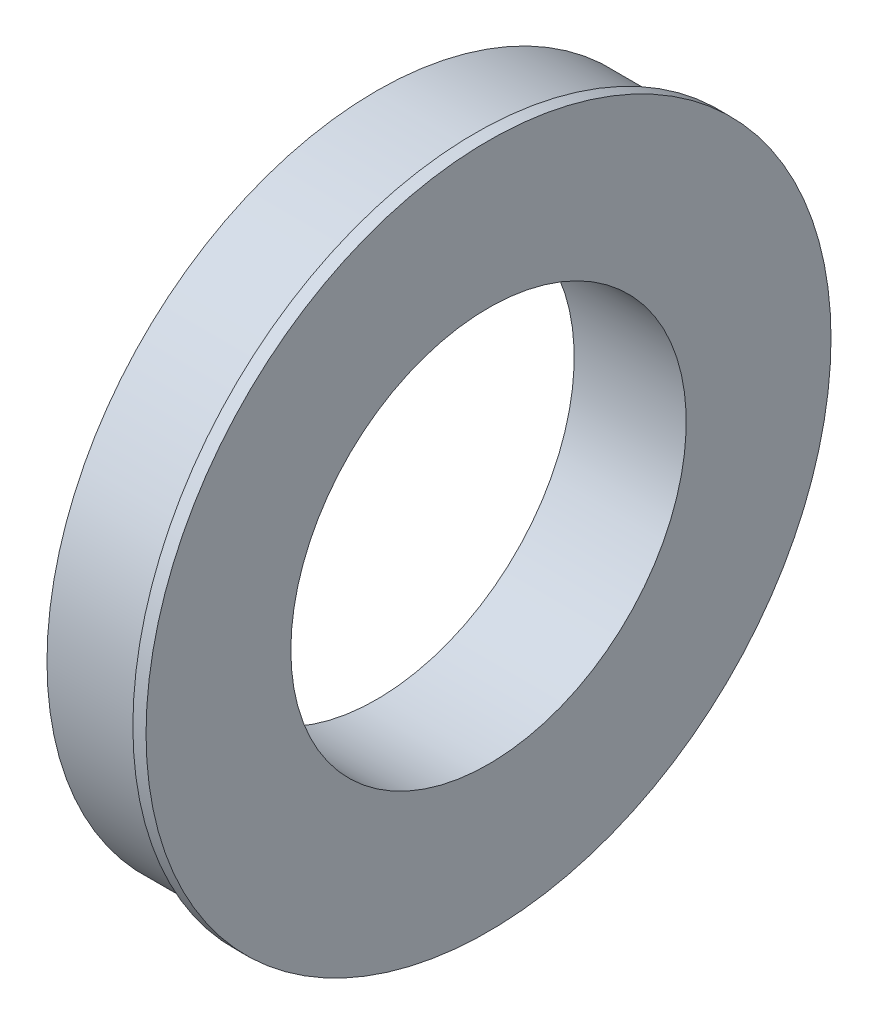
ISO-10303-21;
HEADER;
FILE_DESCRIPTION(('STEP AP214'),'2;1');
FILE_NAME('part.step','',(''),(''),'','','');
FILE_SCHEMA(('AUTOMOTIVE_DESIGN { 1 0 10303 214 1 1 1 1 }'));
ENDSEC;
DATA;
#1=APPLICATION_CONTEXT('core data for automotive mechanical design processes');
#2=APPLICATION_PROTOCOL_DEFINITION('international standard','automotive_design',2000,#1);
#3=PRODUCT_CONTEXT('',#1,'mechanical');
#4=PRODUCT('Part','Part','',(#3));
#5=PRODUCT_RELATED_PRODUCT_CATEGORY('part','',(#4));
#6=PRODUCT_DEFINITION_FORMATION('','',#4);
#7=PRODUCT_DEFINITION_CONTEXT('part definition',#1,'design');
#8=PRODUCT_DEFINITION('design','',#6,#7);
#9=PRODUCT_DEFINITION_SHAPE('','',#8);
#10=(LENGTH_UNIT() NAMED_UNIT(*) SI_UNIT(.MILLI.,.METRE.));
#11=(NAMED_UNIT(*) PLANE_ANGLE_UNIT() SI_UNIT($,.RADIAN.));
#12=(NAMED_UNIT(*) SI_UNIT($,.STERADIAN.) SOLID_ANGLE_UNIT());
#13=UNCERTAINTY_MEASURE_WITH_UNIT(LENGTH_MEASURE(1.E-05),#10,'distance_accuracy_value','');
#14=(GEOMETRIC_REPRESENTATION_CONTEXT(3) GLOBAL_UNCERTAINTY_ASSIGNED_CONTEXT((#13)) GLOBAL_UNIT_ASSIGNED_CONTEXT((#10,
#11,#12)) REPRESENTATION_CONTEXT('',''));
#15=CARTESIAN_POINT('',(0.,0.,0.));
#16=DIRECTION('',(0.,0.,1.));
#17=DIRECTION('',(1.,0.,0.));
#18=AXIS2_PLACEMENT_3D('',#15,#16,#17);
#19=CARTESIAN_POINT('',(0.,0.,0.));
#20=DIRECTION('',(1.,0.,0.));
#21=DIRECTION('',(0.,0.,-1.));
#22=AXIS2_PLACEMENT_3D('',#19,#20,#21);
#23=PLANE('',#22);
#24=CARTESIAN_POINT('',(0.,0.,0.));
#25=DIRECTION('',(1.,0.,0.));
#26=DIRECTION('',(0.,0.,-1.));
#27=AXIS2_PLACEMENT_3D('',#24,#25,#26);
#28=CIRCLE('',#27,63.5);
#29=CARTESIAN_POINT('',(0.,0.,63.5));
#30=VERTEX_POINT('',#29);
#31=EDGE_CURVE('E45',#30,#30,#28,.T.);
#32=ORIENTED_EDGE('',*,*,#31,.F.);
#33=EDGE_LOOP('',(#32));
#34=FACE_BOUND('',#33,.T.);
#35=CARTESIAN_POINT('',(0.,0.,0.));
#36=DIRECTION('',(1.,0.,0.));
#37=DIRECTION('',(0.,0.,-1.));
#38=AXIS2_PLACEMENT_3D('',#35,#36,#37);
#39=CIRCLE('',#38,38.1);
#40=CARTESIAN_POINT('',(0.,0.,38.1));
#41=VERTEX_POINT('',#40);
#42=EDGE_CURVE('E54',#41,#41,#39,.T.);
#43=ORIENTED_EDGE('',*,*,#42,.T.);
#44=EDGE_LOOP('',(#43));
#45=FACE_BOUND('',#44,.T.);
#46=ADVANCED_FACE('F41',(#34,#45),#23,.F.);
#47=CARTESIAN_POINT('',(19.05,0.,0.));
#48=DIRECTION('',(-1.,0.,0.));
#49=DIRECTION('',(0.,0.,1.));
#50=AXIS2_PLACEMENT_3D('',#47,#48,#49);
#51=CYLINDRICAL_SURFACE('',#50,63.5);
#52=CARTESIAN_POINT('',(19.05,0.,0.));
#53=DIRECTION('',(1.,0.,0.));
#54=DIRECTION('',(0.,0.,-1.));
#55=AXIS2_PLACEMENT_3D('',#52,#53,#54);
#56=CIRCLE('',#55,63.5);
#57=CARTESIAN_POINT('',(19.05,0.,63.5));
#58=VERTEX_POINT('',#57);
#59=EDGE_CURVE('E10',#58,#58,#56,.T.);
#60=CARTESIAN_POINT('',(19.05,0.,63.5));
#61=CARTESIAN_POINT('',(18.8515625,0.,63.5));
#62=CARTESIAN_POINT('',(18.653125,0.,63.5));
#63=CARTESIAN_POINT('',(18.25625,0.,63.5));
#64=CARTESIAN_POINT('',(18.0578125,0.,63.5));
#65=CARTESIAN_POINT('',(17.6609375,0.,63.5));
#66=CARTESIAN_POINT('',(17.4625,0.,63.5));
#67=CARTESIAN_POINT('',(17.065625,0.,63.5));
#68=CARTESIAN_POINT('',(16.8671875,0.,63.5));
#69=CARTESIAN_POINT('',(16.4703125,0.,63.5));
#70=CARTESIAN_POINT('',(16.271875,0.,63.5));
#71=CARTESIAN_POINT('',(15.875,0.,63.5));
#72=CARTESIAN_POINT('',(15.6765625,0.,63.5));
#73=CARTESIAN_POINT('',(15.2796875,0.,63.5));
#74=CARTESIAN_POINT('',(15.08125,0.,63.5));
#75=CARTESIAN_POINT('',(14.684375,0.,63.5));
#76=CARTESIAN_POINT('',(14.4859375,0.,63.5));
#77=CARTESIAN_POINT('',(14.0890625,0.,63.5));
#78=CARTESIAN_POINT('',(13.890625,0.,63.5));
#79=CARTESIAN_POINT('',(13.49375,0.,63.5));
#80=CARTESIAN_POINT('',(13.2953125,0.,63.5));
#81=CARTESIAN_POINT('',(12.8984375,0.,63.5));
#82=CARTESIAN_POINT('',(12.7,0.,63.5));
#83=CARTESIAN_POINT('',(12.303125,0.,63.5));
#84=CARTESIAN_POINT('',(12.1046875,0.,63.5));
#85=CARTESIAN_POINT('',(11.7078125,0.,63.5));
#86=CARTESIAN_POINT('',(11.509375,0.,63.5));
#87=CARTESIAN_POINT('',(11.1125,0.,63.5));
#88=CARTESIAN_POINT('',(10.9140625,0.,63.5));
#89=CARTESIAN_POINT('',(10.5171875,0.,63.5));
#90=CARTESIAN_POINT('',(10.31875,0.,63.5));
#91=CARTESIAN_POINT('',(9.921875,0.,63.5));
#92=CARTESIAN_POINT('',(9.7234375,0.,63.5));
#93=CARTESIAN_POINT('',(9.3265625,0.,63.5));
#94=CARTESIAN_POINT('',(9.128125,0.,63.5));
#95=CARTESIAN_POINT('',(8.73125,0.,63.5));
#96=CARTESIAN_POINT('',(8.5328125,0.,63.5));
#97=CARTESIAN_POINT('',(8.1359375,0.,63.5));
#98=CARTESIAN_POINT('',(7.9375,0.,63.5));
#99=CARTESIAN_POINT('',(7.540625,0.,63.5));
#100=CARTESIAN_POINT('',(7.3421875,0.,63.5));
#101=CARTESIAN_POINT('',(6.9453125,0.,63.5));
#102=CARTESIAN_POINT('',(6.746875,0.,63.5));
#103=CARTESIAN_POINT('',(6.35,0.,63.5));
#104=CARTESIAN_POINT('',(6.1515625,0.,63.5));
#105=CARTESIAN_POINT('',(5.7546875,0.,63.5));
#106=CARTESIAN_POINT('',(5.55625,0.,63.5));
#107=CARTESIAN_POINT('',(5.159375,0.,63.5));
#108=CARTESIAN_POINT('',(4.9609375,0.,63.5));
#109=CARTESIAN_POINT('',(4.5640625,0.,63.5));
#110=CARTESIAN_POINT('',(4.365625,0.,63.5));
#111=CARTESIAN_POINT('',(3.96875,0.,63.5));
#112=CARTESIAN_POINT('',(3.7703125,0.,63.5));
#113=CARTESIAN_POINT('',(3.3734375,0.,63.5));
#114=CARTESIAN_POINT('',(3.175,0.,63.5));
#115=CARTESIAN_POINT('',(2.778125,0.,63.5));
#116=CARTESIAN_POINT('',(2.5796875,0.,63.5));
#117=CARTESIAN_POINT('',(2.1828125,0.,63.5));
#118=CARTESIAN_POINT('',(1.984375,0.,63.5));
#119=CARTESIAN_POINT('',(1.5875,0.,63.5));
#120=CARTESIAN_POINT('',(1.3890625,0.,63.5));
#121=CARTESIAN_POINT('',(0.992187500000001,0.,63.5));
#122=CARTESIAN_POINT('',(0.793750000000001,0.,63.5));
#123=CARTESIAN_POINT('',(0.396875,0.,63.5));
#124=CARTESIAN_POINT('',(0.1984375,0.,63.5));
#125=CARTESIAN_POINT('',(0.,0.,63.5));
#126=B_SPLINE_CURVE_WITH_KNOTS('',3,(#60,#61,#62,#63,#64,#65,#66,#67,#68,#69,#70,#71,#72,#73,
#74,#75,#76,#77,#78,#79,#80,#81,#82,#83,#84,#85,#86,#87,#88,#89,#90,#91,#92,#93,#94,#95,#96,#97,
#98,#99,#100,#101,#102,#103,#104,#105,#106,#107,#108,#109,#110,#111,#112,#113,#114,#115,#116,
#117,#118,#119,#120,#121,#122,#123,#124,#125),.UNSPECIFIED.,.F.,.F.,(4,2,2,2,2,2,2,2,2,2,2,2,2,
2,2,2,2,2,2,2,2,2,2,2,2,2,2,2,2,2,2,2,4),(0.,0.5953125,1.190625,1.7859375,2.38125,2.9765625,
3.571875,4.1671875,4.7625,5.3578125,5.953125,6.5484375,7.14375,7.7390625,8.334375,8.9296875,
9.525,10.1203125,10.715625,11.3109375,11.90625,12.5015625,13.096875,13.6921875,14.2875,
14.8828125,15.478125,16.0734375,16.66875,17.2640625,17.859375,18.4546875,19.05),.UNSPECIFIED.);
#127=EDGE_CURVE('BSEAM43',#58,#30,#126,.T.);
#128=ORIENTED_EDGE('',*,*,#59,.F.);
#129=ORIENTED_EDGE('',*,*,#31,.T.);
#130=ORIENTED_EDGE('',*,*,#127,.T.);
#131=ORIENTED_EDGE('',*,*,#127,.F.);
#132=EDGE_LOOP('',(#128,#130,#129,#131));
#133=FACE_BOUND('',#132,.T.);
#134=ADVANCED_FACE('F43',(#133),#51,.T.);
#135=CARTESIAN_POINT('',(19.05,0.,0.));
#136=DIRECTION('',(-1.,0.,0.));
#137=DIRECTION('',(0.,0.,1.));
#138=AXIS2_PLACEMENT_3D('',#135,#136,#137);
#139=CYLINDRICAL_SURFACE('',#138,38.1);
#140=CARTESIAN_POINT('',(21.59,0.,0.));
#141=DIRECTION('',(1.,0.,0.));
#142=DIRECTION('',(0.,0.,-1.));
#143=AXIS2_PLACEMENT_3D('',#140,#141,#142);
#144=CIRCLE('',#143,38.1);
#145=CARTESIAN_POINT('',(21.59,0.,38.1));
#146=VERTEX_POINT('',#145);
#147=EDGE_CURVE('E64',#146,#146,#144,.T.);
#148=CARTESIAN_POINT('',(0.,0.,38.1));
#149=CARTESIAN_POINT('',(0.224895833333333,0.,38.1));
#150=CARTESIAN_POINT('',(0.449791666666667,0.,38.1));
#151=CARTESIAN_POINT('',(0.899583333333333,0.,38.1));
#152=CARTESIAN_POINT('',(1.12447916666667,0.,38.1));
#153=CARTESIAN_POINT('',(1.57427083333333,0.,38.1));
#154=CARTESIAN_POINT('',(1.79916666666667,0.,38.1));
#155=CARTESIAN_POINT('',(2.24895833333333,0.,38.1));
#156=CARTESIAN_POINT('',(2.47385416666667,0.,38.1));
#157=CARTESIAN_POINT('',(2.92364583333333,0.,38.1));
#158=CARTESIAN_POINT('',(3.14854166666667,0.,38.1));
#159=CARTESIAN_POINT('',(3.59833333333333,0.,38.1));
#160=CARTESIAN_POINT('',(3.82322916666667,0.,38.1));
#161=CARTESIAN_POINT('',(4.27302083333333,0.,38.1));
#162=CARTESIAN_POINT('',(4.49791666666667,0.,38.1));
#163=CARTESIAN_POINT('',(4.94770833333333,0.,38.1));
#164=CARTESIAN_POINT('',(5.17260416666667,0.,38.1));
#165=CARTESIAN_POINT('',(5.62239583333333,0.,38.1));
#166=CARTESIAN_POINT('',(5.84729166666667,0.,38.1));
#167=CARTESIAN_POINT('',(6.29708333333333,0.,38.1));
#168=CARTESIAN_POINT('',(6.52197916666667,0.,38.1));
#169=CARTESIAN_POINT('',(6.97177083333333,0.,38.1));
#170=CARTESIAN_POINT('',(7.19666666666667,0.,38.1));
#171=CARTESIAN_POINT('',(7.64645833333333,0.,38.1));
#172=CARTESIAN_POINT('',(7.87135416666667,0.,38.1));
#173=CARTESIAN_POINT('',(8.32114583333333,0.,38.1));
#174=CARTESIAN_POINT('',(8.54604166666667,0.,38.1));
#175=CARTESIAN_POINT('',(8.99583333333334,0.,38.1));
#176=CARTESIAN_POINT('',(9.22072916666667,0.,38.1));
#177=CARTESIAN_POINT('',(9.67052083333333,0.,38.1));
#178=CARTESIAN_POINT('',(9.89541666666667,0.,38.1));
#179=CARTESIAN_POINT('',(10.3452083333333,0.,38.1));
#180=CARTESIAN_POINT('',(10.5701041666667,0.,38.1));
#181=CARTESIAN_POINT('',(11.0198958333333,0.,38.1));
#182=CARTESIAN_POINT('',(11.2447916666667,0.,38.1));
#183=CARTESIAN_POINT('',(11.6945833333333,0.,38.1));
#184=CARTESIAN_POINT('',(11.9194791666667,0.,38.1));
#185=CARTESIAN_POINT('',(12.3692708333333,0.,38.1));
#186=CARTESIAN_POINT('',(12.5941666666667,0.,38.1));
#187=CARTESIAN_POINT('',(13.0439583333333,0.,38.1));
#188=CARTESIAN_POINT('',(13.2688541666667,0.,38.1));
#189=CARTESIAN_POINT('',(13.7186458333333,0.,38.1));
#190=CARTESIAN_POINT('',(13.9435416666667,0.,38.1));
#191=CARTESIAN_POINT('',(14.3933333333333,0.,38.1));
#192=CARTESIAN_POINT('',(14.6182291666667,0.,38.1));
#193=CARTESIAN_POINT('',(15.0680208333333,0.,38.1));
#194=CARTESIAN_POINT('',(15.2929166666667,0.,38.1));
#195=CARTESIAN_POINT('',(15.7427083333333,0.,38.1));
#196=CARTESIAN_POINT('',(15.9676041666667,0.,38.1));
#197=CARTESIAN_POINT('',(16.4173958333333,0.,38.1));
#198=CARTESIAN_POINT('',(16.6422916666667,0.,38.1));
#199=CARTESIAN_POINT('',(17.0920833333333,0.,38.1));
#200=CARTESIAN_POINT('',(17.3169791666667,0.,38.1));
#201=CARTESIAN_POINT('',(17.7667708333333,0.,38.1));
#202=CARTESIAN_POINT('',(17.9916666666667,0.,38.1));
#203=CARTESIAN_POINT('',(18.4414583333333,0.,38.1));
#204=CARTESIAN_POINT('',(18.6663541666667,0.,38.1));
#205=CARTESIAN_POINT('',(19.1161458333333,0.,38.1));
#206=CARTESIAN_POINT('',(19.3410416666667,0.,38.1));
#207=CARTESIAN_POINT('',(19.7908333333333,0.,38.1));
#208=CARTESIAN_POINT('',(20.0157291666667,0.,38.1));
#209=CARTESIAN_POINT('',(20.4655208333333,0.,38.1));
#210=CARTESIAN_POINT('',(20.6904166666667,0.,38.1));
#211=CARTESIAN_POINT('',(21.1402083333333,0.,38.1));
#212=CARTESIAN_POINT('',(21.3651041666667,0.,38.1));
#213=CARTESIAN_POINT('',(21.59,0.,38.1));
#214=B_SPLINE_CURVE_WITH_KNOTS('',3,(#148,#149,#150,#151,#152,#153,#154,#155,#156,#157,#158,
#159,#160,#161,#162,#163,#164,#165,#166,#167,#168,#169,#170,#171,#172,#173,#174,#175,#176,#177,
#178,#179,#180,#181,#182,#183,#184,#185,#186,#187,#188,#189,#190,#191,#192,#193,#194,#195,#196,
#197,#198,#199,#200,#201,#202,#203,#204,#205,#206,#207,#208,#209,#210,#211,#212,#213),
.UNSPECIFIED.,.F.,.F.,(4,2,2,2,2,2,2,2,2,2,2,2,2,2,2,2,2,2,2,2,2,2,2,2,2,2,2,2,2,2,2,2,4),(0.,
0.6746875,1.349375,2.0240625,2.69875,3.3734375,4.048125,4.7228125,5.3975,6.0721875,6.746875,
7.4215625,8.09625,8.7709375,9.445625,10.1203125,10.795,11.4696875,12.144375,12.8190625,13.49375,
14.1684375,14.843125,15.5178125,16.1925,16.8671875,17.541875,18.2165625,18.89125,19.5659375,
20.240625,20.9153125,21.59),.UNSPECIFIED.);
#215=EDGE_CURVE('BSEAM72',#41,#146,#214,.T.);
#216=ORIENTED_EDGE('',*,*,#42,.F.);
#217=ORIENTED_EDGE('',*,*,#147,.T.);
#218=ORIENTED_EDGE('',*,*,#215,.T.);
#219=ORIENTED_EDGE('',*,*,#215,.F.);
#220=EDGE_LOOP('',(#216,#218,#217,#219));
#221=FACE_BOUND('',#220,.T.);
#222=ADVANCED_FACE('F72',(#221),#139,.F.);
#223=CARTESIAN_POINT('',(21.59,0.,0.));
#224=DIRECTION('',(1.,0.,0.));
#225=DIRECTION('',(0.,0.,-1.));
#226=AXIS2_PLACEMENT_3D('',#223,#224,#225);
#227=PLANE('',#226);
#228=CARTESIAN_POINT('',(21.59,0.,0.));
#229=DIRECTION('',(1.,0.,0.));
#230=DIRECTION('',(0.,0.,-1.));
#231=AXIS2_PLACEMENT_3D('',#228,#229,#230);
#232=CIRCLE('',#231,66.);
#233=CARTESIAN_POINT('',(21.59,0.,-66.));
#234=VERTEX_POINT('',#233);
#235=EDGE_CURVE('E59',#234,#234,#232,.T.);
#236=ORIENTED_EDGE('',*,*,#235,.T.);
#237=EDGE_LOOP('',(#236));
#238=FACE_BOUND('',#237,.T.);
#239=ORIENTED_EDGE('',*,*,#147,.F.);
#240=EDGE_LOOP('',(#239));
#241=FACE_BOUND('',#240,.T.);
#242=ADVANCED_FACE('F74',(#238,#241),#227,.T.);
#243=CARTESIAN_POINT('',(19.05,0.,0.));
#244=DIRECTION('',(1.,0.,0.));
#245=DIRECTION('',(0.,0.,-1.));
#246=AXIS2_PLACEMENT_3D('',#243,#244,#245);
#247=PLANE('',#246);
#248=ORIENTED_EDGE('',*,*,#59,.T.);
#249=EDGE_LOOP('',(#248));
#250=FACE_BOUND('',#249,.T.);
#251=CARTESIAN_POINT('',(19.05,0.,0.));
#252=DIRECTION('',(1.,0.,0.));
#253=DIRECTION('',(0.,0.,-1.));
#254=AXIS2_PLACEMENT_3D('',#251,#252,#253);
#255=CIRCLE('',#254,66.);
#256=CARTESIAN_POINT('',(19.05,0.,-66.));
#257=VERTEX_POINT('',#256);
#258=EDGE_CURVE('E60',#257,#257,#255,.T.);
#259=ORIENTED_EDGE('',*,*,#258,.F.);
#260=EDGE_LOOP('',(#259));
#261=FACE_BOUND('',#260,.T.);
#262=ADVANCED_FACE('F76',(#250,#261),#247,.F.);
#263=CARTESIAN_POINT('',(21.59,0.,0.));
#264=DIRECTION('',(-1.,0.,0.));
#265=DIRECTION('',(0.,0.,1.));
#266=AXIS2_PLACEMENT_3D('',#263,#264,#265);
#267=CYLINDRICAL_SURFACE('',#266,66.);
#268=ORIENTED_EDGE('',*,*,#235,.F.);
#269=EDGE_LOOP('',(#268));
#270=FACE_BOUND('',#269,.T.);
#271=ORIENTED_EDGE('',*,*,#258,.T.);
#272=EDGE_LOOP('',(#271));
#273=FACE_BOUND('',#272,.T.);
#274=ADVANCED_FACE('F83',(#270,#273),#267,.T.);
#275=CLOSED_SHELL('',(#46,#134,#222,#242,#262,#274));
#276=MANIFOLD_SOLID_BREP('B2',#275);
#277=ADVANCED_BREP_SHAPE_REPRESENTATION('',(#18,#276),#14);
#278=SHAPE_DEFINITION_REPRESENTATION(#9,#277);
ENDSEC;
END-ISO-10303-21;
